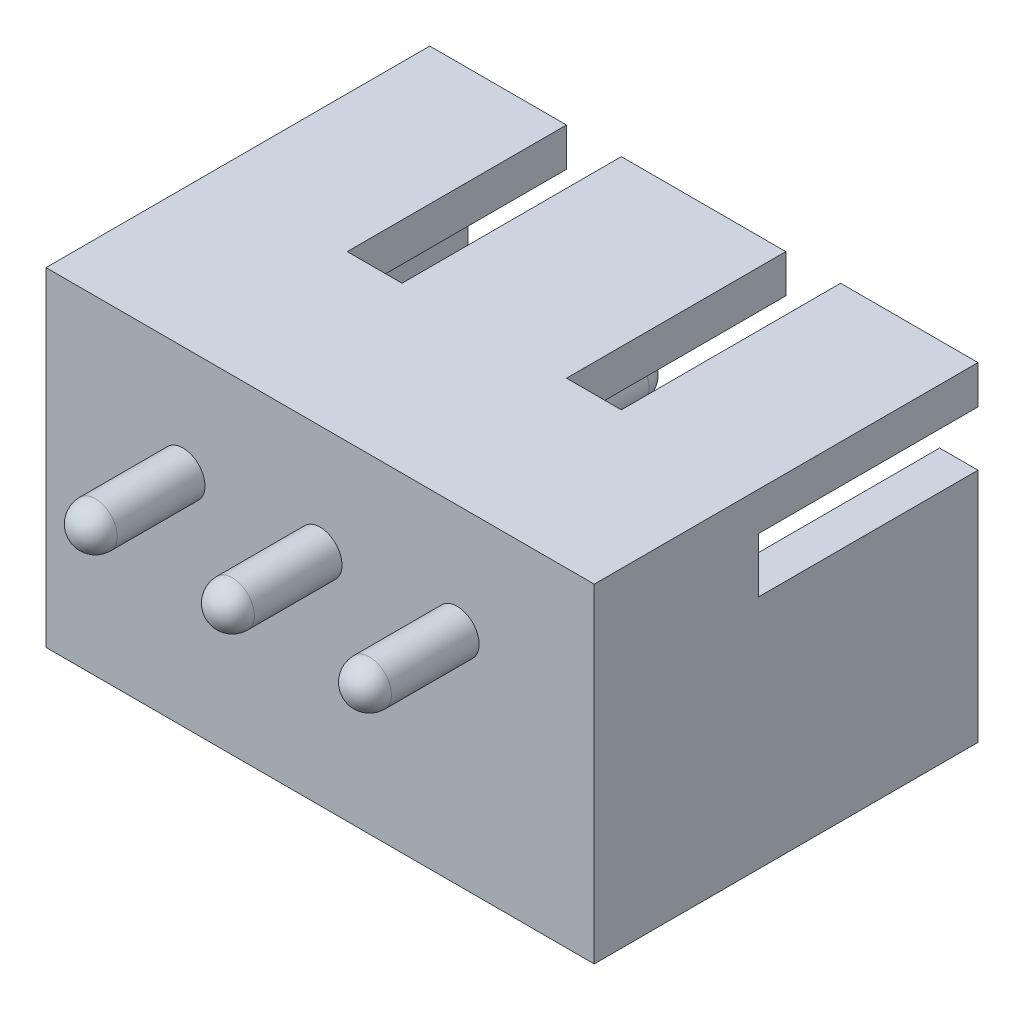
ISO-10303-21;
HEADER;
FILE_DESCRIPTION(('STEP AP214'),'2;1');
FILE_NAME('part.step','',(''),(''),'','','');
FILE_SCHEMA(('AUTOMOTIVE_DESIGN { 1 0 10303 214 1 1 1 1 }'));
ENDSEC;
DATA;
#1=APPLICATION_CONTEXT('core data for automotive mechanical design processes');
#2=APPLICATION_PROTOCOL_DEFINITION('international standard','automotive_design',2000,#1);
#3=PRODUCT_CONTEXT('',#1,'mechanical');
#4=PRODUCT('Part','Part','',(#3));
#5=PRODUCT_RELATED_PRODUCT_CATEGORY('part','',(#4));
#6=PRODUCT_DEFINITION_FORMATION('','',#4);
#7=PRODUCT_DEFINITION_CONTEXT('part definition',#1,'design');
#8=PRODUCT_DEFINITION('design','',#6,#7);
#9=PRODUCT_DEFINITION_SHAPE('','',#8);
#10=(LENGTH_UNIT() NAMED_UNIT(*) SI_UNIT(.MILLI.,.METRE.));
#11=(NAMED_UNIT(*) PLANE_ANGLE_UNIT() SI_UNIT($,.RADIAN.));
#12=(NAMED_UNIT(*) SI_UNIT($,.STERADIAN.) SOLID_ANGLE_UNIT());
#13=UNCERTAINTY_MEASURE_WITH_UNIT(LENGTH_MEASURE(1.E-05),#10,'distance_accuracy_value','');
#14=(GEOMETRIC_REPRESENTATION_CONTEXT(3) GLOBAL_UNCERTAINTY_ASSIGNED_CONTEXT((#13)) GLOBAL_UNIT_ASSIGNED_CONTEXT((#10,
#11,#12)) REPRESENTATION_CONTEXT('',''));
#15=CARTESIAN_POINT('',(0.,0.,0.));
#16=DIRECTION('',(0.,0.,1.));
#17=DIRECTION('',(1.,0.,0.));
#18=AXIS2_PLACEMENT_3D('',#15,#16,#17);
#19=CARTESIAN_POINT('',(0.,6.,0.));
#20=DIRECTION('',(0.,0.,-1.));
#21=DIRECTION('',(-1.,0.,0.));
#22=AXIS2_PLACEMENT_3D('',#19,#20,#21);
#23=PLANE('',#22);
#24=DIRECTION('',(1.,0.,0.));
#25=VECTOR('',#24,1.);
#26=CARTESIAN_POINT('',(0.,4.3,0.));
#27=LINE('',#26,#25);
#28=CARTESIAN_POINT('',(9.3,4.3,0.));
#29=VERTEX_POINT('',#28);
#30=CARTESIAN_POINT('',(10.,4.3,0.));
#31=VERTEX_POINT('',#30);
#32=EDGE_CURVE('E427',#29,#31,#27,.T.);
#33=ORIENTED_EDGE('',*,*,#32,.T.);
#34=DIRECTION('',(0.,1.,0.));
#35=VECTOR('',#34,1.);
#36=CARTESIAN_POINT('',(10.,0.,0.));
#37=LINE('',#36,#35);
#38=CARTESIAN_POINT('',(10.,0.,0.));
#39=VERTEX_POINT('',#38);
#40=EDGE_CURVE('E225',#39,#31,#37,.T.);
#41=ORIENTED_EDGE('',*,*,#40,.F.);
#42=DIRECTION('',(1.,0.,0.));
#43=VECTOR('',#42,1.);
#44=CARTESIAN_POINT('',(0.,0.,0.));
#45=LINE('',#44,#43);
#46=CARTESIAN_POINT('',(0.,0.,0.));
#47=VERTEX_POINT('',#46);
#48=EDGE_CURVE('E215',#47,#39,#45,.T.);
#49=ORIENTED_EDGE('',*,*,#48,.F.);
#50=DIRECTION('',(0.,-1.,0.));
#51=VECTOR('',#50,1.);
#52=CARTESIAN_POINT('',(0.,0.,0.));
#53=LINE('',#52,#51);
#54=CARTESIAN_POINT('',(0.,4.3,0.));
#55=VERTEX_POINT('',#54);
#56=EDGE_CURVE('E216',#55,#47,#53,.T.);
#57=ORIENTED_EDGE('',*,*,#56,.F.);
#58=CARTESIAN_POINT('',(0.7,4.3,0.));
#59=VERTEX_POINT('',#58);
#60=EDGE_CURVE('E421',#55,#59,#27,.T.);
#61=ORIENTED_EDGE('',*,*,#60,.T.);
#62=DIRECTION('',(0.,-1.,0.));
#63=VECTOR('',#62,1.);
#64=CARTESIAN_POINT('',(0.699999999999999,0.699999999999999,0.));
#65=LINE('',#64,#63);
#66=CARTESIAN_POINT('',(0.699999999999999,0.699999999999999,0.));
#67=VERTEX_POINT('',#66);
#68=EDGE_CURVE('E360',#59,#67,#65,.T.);
#69=ORIENTED_EDGE('',*,*,#68,.T.);
#70=DIRECTION('',(1.,0.,0.));
#71=VECTOR('',#70,1.);
#72=CARTESIAN_POINT('',(9.3,0.7,0.));
#73=LINE('',#72,#71);
#74=CARTESIAN_POINT('',(9.3,0.7,0.));
#75=VERTEX_POINT('',#74);
#76=EDGE_CURVE('E372',#67,#75,#73,.T.);
#77=ORIENTED_EDGE('',*,*,#76,.T.);
#78=DIRECTION('',(0.,1.,0.));
#79=VECTOR('',#78,1.);
#80=CARTESIAN_POINT('',(9.3,5.3,0.));
#81=LINE('',#80,#79);
#82=EDGE_CURVE('E195',#75,#29,#81,.T.);
#83=ORIENTED_EDGE('',*,*,#82,.T.);
#84=EDGE_LOOP('',(#33,#41,#49,#57,#61,#69,#77,#83));
#85=FACE_BOUND('',#84,.T.);
#86=ADVANCED_FACE('F35',(#85),#23,.T.);
#87=DIRECTION('',(-1.,0.,0.));
#88=VECTOR('',#87,1.);
#89=CARTESIAN_POINT('',(0.7,5.3,0.));
#90=LINE('',#89,#88);
#91=CARTESIAN_POINT('',(2.49408032981119,5.3,0.));
#92=VERTEX_POINT('',#91);
#93=CARTESIAN_POINT('',(0.,5.3,0.));
#94=VERTEX_POINT('',#93);
#95=EDGE_CURVE('E186',#92,#94,#90,.T.);
#96=ORIENTED_EDGE('',*,*,#95,.T.);
#97=CARTESIAN_POINT('',(0.,6.,0.));
#98=VERTEX_POINT('',#97);
#99=EDGE_CURVE('E191',#98,#94,#53,.T.);
#100=ORIENTED_EDGE('',*,*,#99,.F.);
#101=DIRECTION('',(-1.,0.,0.));
#102=VECTOR('',#101,1.);
#103=CARTESIAN_POINT('',(0.,6.,0.));
#104=LINE('',#103,#102);
#105=CARTESIAN_POINT('',(2.49408032981119,6.,0.));
#106=VERTEX_POINT('',#105);
#107=EDGE_CURVE('E228',#106,#98,#104,.T.);
#108=ORIENTED_EDGE('',*,*,#107,.F.);
#109=DIRECTION('',(0.,1.,0.));
#110=VECTOR('',#109,1.);
#111=CARTESIAN_POINT('',(2.49408032981119,-0.00100000000000013,0.));
#112=LINE('',#111,#110);
#113=EDGE_CURVE('E192',#92,#106,#112,.T.);
#114=ORIENTED_EDGE('',*,*,#113,.F.);
#115=EDGE_LOOP('',(#96,#100,#108,#114));
#116=FACE_BOUND('',#115,.T.);
#117=ADVANCED_FACE('F188',(#116),#23,.T.);
#118=CARTESIAN_POINT('',(10.,5.3,0.));
#119=VERTEX_POINT('',#118);
#120=CARTESIAN_POINT('',(10.,6.,0.));
#121=VERTEX_POINT('',#120);
#122=EDGE_CURVE('E218',#119,#121,#37,.T.);
#123=ORIENTED_EDGE('',*,*,#122,.F.);
#124=CARTESIAN_POINT('',(7.49408032981119,5.3,0.));
#125=VERTEX_POINT('',#124);
#126=EDGE_CURVE('E197',#119,#125,#90,.T.);
#127=ORIENTED_EDGE('',*,*,#126,.T.);
#128=DIRECTION('',(0.,1.,0.));
#129=VECTOR('',#128,1.);
#130=CARTESIAN_POINT('',(7.49408032981119,-0.00100000000000013,0.));
#131=LINE('',#130,#129);
#132=CARTESIAN_POINT('',(7.49408032981119,6.,0.));
#133=VERTEX_POINT('',#132);
#134=EDGE_CURVE('E349',#125,#133,#131,.T.);
#135=ORIENTED_EDGE('',*,*,#134,.T.);
#136=EDGE_CURVE('E229',#121,#133,#104,.T.);
#137=ORIENTED_EDGE('',*,*,#136,.F.);
#138=EDGE_LOOP('',(#123,#127,#135,#137));
#139=FACE_BOUND('',#138,.T.);
#140=ADVANCED_FACE('F290',(#139),#23,.T.);
#141=DIRECTION('',(0.,1.,0.));
#142=VECTOR('',#141,1.);
#143=CARTESIAN_POINT('',(3.49408032981119,-0.00100000000000013,0.));
#144=LINE('',#143,#142);
#145=CARTESIAN_POINT('',(3.49408032981119,5.3,0.));
#146=VERTEX_POINT('',#145);
#147=CARTESIAN_POINT('',(3.49408032981119,6.,0.));
#148=VERTEX_POINT('',#147);
#149=EDGE_CURVE('E58',#146,#148,#144,.T.);
#150=ORIENTED_EDGE('',*,*,#149,.T.);
#151=CARTESIAN_POINT('',(6.49408032981119,6.,0.));
#152=VERTEX_POINT('',#151);
#153=EDGE_CURVE('E233',#152,#148,#104,.T.);
#154=ORIENTED_EDGE('',*,*,#153,.F.);
#155=DIRECTION('',(0.,1.,0.));
#156=VECTOR('',#155,1.);
#157=CARTESIAN_POINT('',(6.49408032981119,-0.00100000000000013,0.));
#158=LINE('',#157,#156);
#159=CARTESIAN_POINT('',(6.49408032981119,5.3,0.));
#160=VERTEX_POINT('',#159);
#161=EDGE_CURVE('E348',#160,#152,#158,.T.);
#162=ORIENTED_EDGE('',*,*,#161,.F.);
#163=EDGE_CURVE('E194',#160,#146,#90,.T.);
#164=ORIENTED_EDGE('',*,*,#163,.T.);
#165=EDGE_LOOP('',(#150,#154,#162,#164));
#166=FACE_BOUND('',#165,.T.);
#167=ADVANCED_FACE('F286',(#166),#23,.T.);
#168=CARTESIAN_POINT('',(0.,0.,7.));
#169=DIRECTION('',(1.,0.,0.));
#170=DIRECTION('',(0.,0.,-1.));
#171=AXIS2_PLACEMENT_3D('',#168,#169,#170);
#172=PLANE('',#171);
#173=DIRECTION('',(0.,-1.,0.));
#174=VECTOR('',#173,1.);
#175=CARTESIAN_POINT('',(0.,5.3,4.));
#176=LINE('',#175,#174);
#177=CARTESIAN_POINT('',(0.,5.3,4.));
#178=VERTEX_POINT('',#177);
#179=CARTESIAN_POINT('',(0.,4.3,4.));
#180=VERTEX_POINT('',#179);
#181=EDGE_CURVE('E207',#178,#180,#176,.T.);
#182=ORIENTED_EDGE('',*,*,#181,.T.);
#183=DIRECTION('',(0.,0.,-1.));
#184=VECTOR('',#183,1.);
#185=CARTESIAN_POINT('',(0.,4.3,0.));
#186=LINE('',#185,#184);
#187=EDGE_CURVE('E437',#180,#55,#186,.T.);
#188=ORIENTED_EDGE('',*,*,#187,.T.);
#189=ORIENTED_EDGE('',*,*,#56,.T.);
#190=DIRECTION('',(0.,0.,-1.));
#191=VECTOR('',#190,1.);
#192=CARTESIAN_POINT('',(0.,0.,7.));
#193=LINE('',#192,#191);
#194=CARTESIAN_POINT('',(0.,0.,7.));
#195=VERTEX_POINT('',#194);
#196=EDGE_CURVE('E241',#195,#47,#193,.T.);
#197=ORIENTED_EDGE('',*,*,#196,.F.);
#198=DIRECTION('',(0.,-1.,0.));
#199=VECTOR('',#198,1.);
#200=CARTESIAN_POINT('',(0.,0.,7.));
#201=LINE('',#200,#199);
#202=CARTESIAN_POINT('',(0.,6.,7.));
#203=VERTEX_POINT('',#202);
#204=EDGE_CURVE('E232',#203,#195,#201,.T.);
#205=ORIENTED_EDGE('',*,*,#204,.F.);
#206=DIRECTION('',(0.,0.,-1.));
#207=VECTOR('',#206,1.);
#208=CARTESIAN_POINT('',(0.,6.,7.));
#209=LINE('',#208,#207);
#210=EDGE_CURVE('E214',#203,#98,#209,.T.);
#211=ORIENTED_EDGE('',*,*,#210,.T.);
#212=ORIENTED_EDGE('',*,*,#99,.T.);
#213=DIRECTION('',(0.,0.,1.));
#214=VECTOR('',#213,1.);
#215=CARTESIAN_POINT('',(0.,5.3,0.));
#216=LINE('',#215,#214);
#217=EDGE_CURVE('E199',#94,#178,#216,.T.);
#218=ORIENTED_EDGE('',*,*,#217,.T.);
#219=EDGE_LOOP('',(#182,#188,#189,#197,#205,#211,#212,#218));
#220=FACE_BOUND('',#219,.T.);
#221=ADVANCED_FACE('F211',(#220),#172,.F.);
#222=CARTESIAN_POINT('',(0.,0.,7.));
#223=DIRECTION('',(0.,1.,0.));
#224=DIRECTION('',(0.,0.,1.));
#225=AXIS2_PLACEMENT_3D('',#222,#223,#224);
#226=PLANE('',#225);
#227=ORIENTED_EDGE('',*,*,#48,.T.);
#228=DIRECTION('',(0.,0.,-1.));
#229=VECTOR('',#228,1.);
#230=CARTESIAN_POINT('',(10.,0.,7.));
#231=LINE('',#230,#229);
#232=CARTESIAN_POINT('',(10.,0.,7.));
#233=VERTEX_POINT('',#232);
#234=EDGE_CURVE('E238',#233,#39,#231,.T.);
#235=ORIENTED_EDGE('',*,*,#234,.F.);
#236=DIRECTION('',(1.,0.,0.));
#237=VECTOR('',#236,1.);
#238=CARTESIAN_POINT('',(0.,0.,7.));
#239=LINE('',#238,#237);
#240=EDGE_CURVE('E388',#195,#233,#239,.T.);
#241=ORIENTED_EDGE('',*,*,#240,.F.);
#242=ORIENTED_EDGE('',*,*,#196,.T.);
#243=EDGE_LOOP('',(#227,#235,#241,#242));
#244=FACE_BOUND('',#243,.T.);
#245=ADVANCED_FACE('F300',(#244),#226,.F.);
#246=CARTESIAN_POINT('',(10.,0.,7.));
#247=DIRECTION('',(-1.,0.,0.));
#248=DIRECTION('',(0.,0.,1.));
#249=AXIS2_PLACEMENT_3D('',#246,#247,#248);
#250=PLANE('',#249);
#251=ORIENTED_EDGE('',*,*,#40,.T.);
#252=DIRECTION('',(0.,0.,-1.));
#253=VECTOR('',#252,1.);
#254=CARTESIAN_POINT('',(10.,4.3,0.));
#255=LINE('',#254,#253);
#256=CARTESIAN_POINT('',(10.,4.3,4.));
#257=VERTEX_POINT('',#256);
#258=EDGE_CURVE('E208',#257,#31,#255,.T.);
#259=ORIENTED_EDGE('',*,*,#258,.F.);
#260=DIRECTION('',(0.,-1.,0.));
#261=VECTOR('',#260,1.);
#262=CARTESIAN_POINT('',(10.,5.3,4.));
#263=LINE('',#262,#261);
#264=CARTESIAN_POINT('',(10.,5.3,4.));
#265=VERTEX_POINT('',#264);
#266=EDGE_CURVE('E431',#265,#257,#263,.T.);
#267=ORIENTED_EDGE('',*,*,#266,.F.);
#268=DIRECTION('',(0.,0.,1.));
#269=VECTOR('',#268,1.);
#270=CARTESIAN_POINT('',(10.,5.3,0.));
#271=LINE('',#270,#269);
#272=EDGE_CURVE('E434',#119,#265,#271,.T.);
#273=ORIENTED_EDGE('',*,*,#272,.F.);
#274=ORIENTED_EDGE('',*,*,#122,.T.);
#275=DIRECTION('',(0.,0.,-1.));
#276=VECTOR('',#275,1.);
#277=CARTESIAN_POINT('',(10.,6.,7.));
#278=LINE('',#277,#276);
#279=CARTESIAN_POINT('',(10.,6.,7.));
#280=VERTEX_POINT('',#279);
#281=EDGE_CURVE('E235',#280,#121,#278,.T.);
#282=ORIENTED_EDGE('',*,*,#281,.F.);
#283=DIRECTION('',(0.,1.,0.));
#284=VECTOR('',#283,1.);
#285=CARTESIAN_POINT('',(10.,0.,7.));
#286=LINE('',#285,#284);
#287=EDGE_CURVE('E389',#233,#280,#286,.T.);
#288=ORIENTED_EDGE('',*,*,#287,.F.);
#289=ORIENTED_EDGE('',*,*,#234,.T.);
#290=EDGE_LOOP('',(#251,#259,#267,#273,#274,#282,#288,#289));
#291=FACE_BOUND('',#290,.T.);
#292=ADVANCED_FACE('F523',(#291),#250,.F.);
#293=CARTESIAN_POINT('',(0.,6.,7.));
#294=DIRECTION('',(0.,-1.,0.));
#295=DIRECTION('',(0.,0.,-1.));
#296=AXIS2_PLACEMENT_3D('',#293,#294,#295);
#297=PLANE('',#296);
#298=DIRECTION('',(1.,0.,0.));
#299=VECTOR('',#298,1.);
#300=CARTESIAN_POINT('',(2.49408032981119,6.,4.));
#301=LINE('',#300,#299);
#302=CARTESIAN_POINT('',(2.49408032981119,6.,4.));
#303=VERTEX_POINT('',#302);
#304=CARTESIAN_POINT('',(3.49408032981119,6.,4.));
#305=VERTEX_POINT('',#304);
#306=EDGE_CURVE('E308',#303,#305,#301,.T.);
#307=ORIENTED_EDGE('',*,*,#306,.F.);
#308=DIRECTION('',(0.,0.,1.));
#309=VECTOR('',#308,1.);
#310=CARTESIAN_POINT('',(2.49408032981119,6.,0.));
#311=LINE('',#310,#309);
#312=EDGE_CURVE('E322',#106,#303,#311,.T.);
#313=ORIENTED_EDGE('',*,*,#312,.F.);
#314=ORIENTED_EDGE('',*,*,#107,.T.);
#315=ORIENTED_EDGE('',*,*,#210,.F.);
#316=DIRECTION('',(-1.,0.,0.));
#317=VECTOR('',#316,1.);
#318=CARTESIAN_POINT('',(0.,6.,7.));
#319=LINE('',#318,#317);
#320=EDGE_CURVE('E222',#280,#203,#319,.T.);
#321=ORIENTED_EDGE('',*,*,#320,.F.);
#322=ORIENTED_EDGE('',*,*,#281,.T.);
#323=ORIENTED_EDGE('',*,*,#136,.T.);
#324=DIRECTION('',(0.,0.,-1.));
#325=VECTOR('',#324,1.);
#326=CARTESIAN_POINT('',(7.49408032981119,6.,0.));
#327=LINE('',#326,#325);
#328=CARTESIAN_POINT('',(7.49408032981119,6.,4.));
#329=VERTEX_POINT('',#328);
#330=EDGE_CURVE('E346',#329,#133,#327,.T.);
#331=ORIENTED_EDGE('',*,*,#330,.F.);
#332=DIRECTION('',(1.,0.,0.));
#333=VECTOR('',#332,1.);
#334=CARTESIAN_POINT('',(7.49408032981119,6.,4.));
#335=LINE('',#334,#333);
#336=CARTESIAN_POINT('',(6.49408032981119,6.,4.));
#337=VERTEX_POINT('',#336);
#338=EDGE_CURVE('E343',#337,#329,#335,.T.);
#339=ORIENTED_EDGE('',*,*,#338,.F.);
#340=DIRECTION('',(0.,0.,1.));
#341=VECTOR('',#340,1.);
#342=CARTESIAN_POINT('',(6.49408032981119,6.,0.));
#343=LINE('',#342,#341);
#344=EDGE_CURVE('E318',#152,#337,#343,.T.);
#345=ORIENTED_EDGE('',*,*,#344,.F.);
#346=ORIENTED_EDGE('',*,*,#153,.T.);
#347=DIRECTION('',(0.,0.,-1.));
#348=VECTOR('',#347,1.);
#349=CARTESIAN_POINT('',(3.49408032981119,6.,0.));
#350=LINE('',#349,#348);
#351=EDGE_CURVE('E315',#305,#148,#350,.T.);
#352=ORIENTED_EDGE('',*,*,#351,.F.);
#353=EDGE_LOOP('',(#307,#313,#314,#315,#321,#322,#323,#331,#339,#345,#346,#352));
#354=FACE_BOUND('',#353,.T.);
#355=ADVANCED_FACE('F314',(#354),#297,.F.);
#356=CARTESIAN_POINT('',(0.,6.,7.));
#357=DIRECTION('',(0.,0.,-1.));
#358=DIRECTION('',(-1.,0.,0.));
#359=AXIS2_PLACEMENT_3D('',#356,#357,#358);
#360=PLANE('',#359);
#361=CARTESIAN_POINT('',(2.5,4.,7.));
#362=DIRECTION('',(0.,0.,-1.));
#363=DIRECTION('',(-1.,0.,0.));
#364=AXIS2_PLACEMENT_3D('',#361,#362,#363);
#365=CIRCLE('',#364,0.4);
#366=CARTESIAN_POINT('',(2.1,4.,7.));
#367=VERTEX_POINT('',#366);
#368=EDGE_CURVE('E446',#367,#367,#365,.T.);
#369=ORIENTED_EDGE('',*,*,#368,.T.);
#370=EDGE_LOOP('',(#369));
#371=FACE_BOUND('',#370,.T.);
#372=CARTESIAN_POINT('',(7.5,4.,7.));
#373=DIRECTION('',(0.,0.,-1.));
#374=DIRECTION('',(-1.,0.,0.));
#375=AXIS2_PLACEMENT_3D('',#372,#373,#374);
#376=CIRCLE('',#375,0.4);
#377=CARTESIAN_POINT('',(7.1,4.,7.));
#378=VERTEX_POINT('',#377);
#379=EDGE_CURVE('E443',#378,#378,#376,.T.);
#380=ORIENTED_EDGE('',*,*,#379,.T.);
#381=EDGE_LOOP('',(#380));
#382=FACE_BOUND('',#381,.T.);
#383=CARTESIAN_POINT('',(5.,4.,7.));
#384=DIRECTION('',(0.,0.,-1.));
#385=DIRECTION('',(-1.,0.,0.));
#386=AXIS2_PLACEMENT_3D('',#383,#384,#385);
#387=CIRCLE('',#386,0.4);
#388=CARTESIAN_POINT('',(4.6,4.,7.));
#389=VERTEX_POINT('',#388);
#390=EDGE_CURVE('E436',#389,#389,#387,.T.);
#391=ORIENTED_EDGE('',*,*,#390,.T.);
#392=EDGE_LOOP('',(#391));
#393=FACE_BOUND('',#392,.T.);
#394=ORIENTED_EDGE('',*,*,#204,.T.);
#395=ORIENTED_EDGE('',*,*,#240,.T.);
#396=ORIENTED_EDGE('',*,*,#287,.T.);
#397=ORIENTED_EDGE('',*,*,#320,.T.);
#398=EDGE_LOOP('',(#394,#395,#396,#397));
#399=FACE_BOUND('',#398,.T.);
#400=ADVANCED_FACE('F393',(#371,#382,#393,#399),#360,.F.);
#401=CARTESIAN_POINT('',(0.699999999999999,0.699999999999999,5.));
#402=DIRECTION('',(1.,0.,0.));
#403=DIRECTION('',(0.,1.,0.));
#404=AXIS2_PLACEMENT_3D('',#401,#402,#403);
#405=PLANE('',#404);
#406=DIRECTION('',(0.,0.,-1.));
#407=VECTOR('',#406,1.);
#408=CARTESIAN_POINT('',(0.7,4.3,5.));
#409=LINE('',#408,#407);
#410=CARTESIAN_POINT('',(0.7,4.3,4.));
#411=VERTEX_POINT('',#410);
#412=EDGE_CURVE('E415',#411,#59,#409,.T.);
#413=ORIENTED_EDGE('',*,*,#412,.F.);
#414=DIRECTION('',(0.,-1.,0.));
#415=VECTOR('',#414,1.);
#416=CARTESIAN_POINT('',(0.699999999999999,0.699999999999998,4.));
#417=LINE('',#416,#415);
#418=CARTESIAN_POINT('',(0.7,5.3,4.));
#419=VERTEX_POINT('',#418);
#420=EDGE_CURVE('E417',#419,#411,#417,.T.);
#421=ORIENTED_EDGE('',*,*,#420,.F.);
#422=DIRECTION('',(0.,0.,-1.));
#423=VECTOR('',#422,1.);
#424=CARTESIAN_POINT('',(0.7,5.3,5.));
#425=LINE('',#424,#423);
#426=CARTESIAN_POINT('',(0.7,5.3,5.));
#427=VERTEX_POINT('',#426);
#428=EDGE_CURVE('E370',#427,#419,#425,.T.);
#429=ORIENTED_EDGE('',*,*,#428,.F.);
#430=DIRECTION('',(0.,-1.,0.));
#431=VECTOR('',#430,1.);
#432=CARTESIAN_POINT('',(0.699999999999999,0.699999999999999,5.));
#433=LINE('',#432,#431);
#434=CARTESIAN_POINT('',(0.699999999999999,0.699999999999999,5.));
#435=VERTEX_POINT('',#434);
#436=EDGE_CURVE('E361',#427,#435,#433,.T.);
#437=ORIENTED_EDGE('',*,*,#436,.T.);
#438=DIRECTION('',(0.,0.,-1.));
#439=VECTOR('',#438,1.);
#440=CARTESIAN_POINT('',(0.699999999999999,0.699999999999999,5.));
#441=LINE('',#440,#439);
#442=EDGE_CURVE('E220',#435,#67,#441,.T.);
#443=ORIENTED_EDGE('',*,*,#442,.T.);
#444=ORIENTED_EDGE('',*,*,#68,.F.);
#445=EDGE_LOOP('',(#413,#421,#429,#437,#443,#444));
#446=FACE_BOUND('',#445,.T.);
#447=ADVANCED_FACE('F515',(#446),#405,.T.);
#448=CARTESIAN_POINT('',(9.3,0.7,5.));
#449=DIRECTION('',(0.,1.,0.));
#450=DIRECTION('',(-1.,0.,0.));
#451=AXIS2_PLACEMENT_3D('',#448,#449,#450);
#452=PLANE('',#451);
#453=ORIENTED_EDGE('',*,*,#76,.F.);
#454=ORIENTED_EDGE('',*,*,#442,.F.);
#455=DIRECTION('',(1.,0.,0.));
#456=VECTOR('',#455,1.);
#457=CARTESIAN_POINT('',(9.3,0.7,5.));
#458=LINE('',#457,#456);
#459=CARTESIAN_POINT('',(9.3,0.7,5.));
#460=VERTEX_POINT('',#459);
#461=EDGE_CURVE('E364',#435,#460,#458,.T.);
#462=ORIENTED_EDGE('',*,*,#461,.T.);
#463=DIRECTION('',(0.,0.,-1.));
#464=VECTOR('',#463,1.);
#465=CARTESIAN_POINT('',(9.3,0.7,5.));
#466=LINE('',#465,#464);
#467=EDGE_CURVE('E382',#460,#75,#466,.T.);
#468=ORIENTED_EDGE('',*,*,#467,.T.);
#469=EDGE_LOOP('',(#453,#454,#462,#468));
#470=FACE_BOUND('',#469,.T.);
#471=ADVANCED_FACE('F511',(#470),#452,.T.);
#472=CARTESIAN_POINT('',(9.3,5.3,5.));
#473=DIRECTION('',(-1.,0.,0.));
#474=DIRECTION('',(0.,0.,1.));
#475=AXIS2_PLACEMENT_3D('',#472,#473,#474);
#476=PLANE('',#475);
#477=DIRECTION('',(0.,0.,1.));
#478=VECTOR('',#477,1.);
#479=CARTESIAN_POINT('',(9.3,4.3,5.));
#480=LINE('',#479,#478);
#481=CARTESIAN_POINT('',(9.3,4.3,4.));
#482=VERTEX_POINT('',#481);
#483=EDGE_CURVE('E244',#29,#482,#480,.T.);
#484=ORIENTED_EDGE('',*,*,#483,.F.);
#485=ORIENTED_EDGE('',*,*,#82,.F.);
#486=ORIENTED_EDGE('',*,*,#467,.F.);
#487=DIRECTION('',(0.,1.,0.));
#488=VECTOR('',#487,1.);
#489=CARTESIAN_POINT('',(9.3,5.3,5.));
#490=LINE('',#489,#488);
#491=CARTESIAN_POINT('',(9.3,5.3,5.));
#492=VERTEX_POINT('',#491);
#493=EDGE_CURVE('E366',#460,#492,#490,.T.);
#494=ORIENTED_EDGE('',*,*,#493,.T.);
#495=DIRECTION('',(0.,0.,-1.));
#496=VECTOR('',#495,1.);
#497=CARTESIAN_POINT('',(9.3,5.3,5.));
#498=LINE('',#497,#496);
#499=CARTESIAN_POINT('',(9.3,5.3,4.));
#500=VERTEX_POINT('',#499);
#501=EDGE_CURVE('E379',#492,#500,#498,.T.);
#502=ORIENTED_EDGE('',*,*,#501,.T.);
#503=DIRECTION('',(0.,1.,0.));
#504=VECTOR('',#503,1.);
#505=CARTESIAN_POINT('',(9.3,5.3,4.));
#506=LINE('',#505,#504);
#507=EDGE_CURVE('E419',#482,#500,#506,.T.);
#508=ORIENTED_EDGE('',*,*,#507,.F.);
#509=EDGE_LOOP('',(#484,#485,#486,#494,#502,#508));
#510=FACE_BOUND('',#509,.T.);
#511=ADVANCED_FACE('F508',(#510),#476,.T.);
#512=CARTESIAN_POINT('',(0.7,5.3,5.));
#513=DIRECTION('',(0.,-1.,0.));
#514=DIRECTION('',(0.,0.,-1.));
#515=AXIS2_PLACEMENT_3D('',#512,#513,#514);
#516=PLANE('',#515);
#517=DIRECTION('',(1.,0.,0.));
#518=VECTOR('',#517,1.);
#519=CARTESIAN_POINT('',(7.49408032981119,5.3,4.));
#520=LINE('',#519,#518);
#521=CARTESIAN_POINT('',(6.49408032981119,5.3,4.));
#522=VERTEX_POINT('',#521);
#523=CARTESIAN_POINT('',(7.49408032981119,5.3,4.));
#524=VERTEX_POINT('',#523);
#525=EDGE_CURVE('E334',#522,#524,#520,.T.);
#526=ORIENTED_EDGE('',*,*,#525,.T.);
#527=DIRECTION('',(0.,0.,-1.));
#528=VECTOR('',#527,1.);
#529=CARTESIAN_POINT('',(7.49408032981119,5.3,0.));
#530=LINE('',#529,#528);
#531=EDGE_CURVE('E339',#524,#125,#530,.T.);
#532=ORIENTED_EDGE('',*,*,#531,.T.);
#533=ORIENTED_EDGE('',*,*,#126,.F.);
#534=ORIENTED_EDGE('',*,*,#272,.T.);
#535=DIRECTION('',(1.,0.,0.));
#536=VECTOR('',#535,1.);
#537=CARTESIAN_POINT('',(0.,5.3,4.));
#538=LINE('',#537,#536);
#539=EDGE_CURVE('E50',#500,#265,#538,.T.);
#540=ORIENTED_EDGE('',*,*,#539,.F.);
#541=ORIENTED_EDGE('',*,*,#501,.F.);
#542=DIRECTION('',(-1.,0.,0.));
#543=VECTOR('',#542,1.);
#544=CARTESIAN_POINT('',(0.7,5.3,5.));
#545=LINE('',#544,#543);
#546=EDGE_CURVE('E368',#492,#427,#545,.T.);
#547=ORIENTED_EDGE('',*,*,#546,.T.);
#548=ORIENTED_EDGE('',*,*,#428,.T.);
#549=EDGE_CURVE('E203',#178,#419,#538,.T.);
#550=ORIENTED_EDGE('',*,*,#549,.F.);
#551=ORIENTED_EDGE('',*,*,#217,.F.);
#552=ORIENTED_EDGE('',*,*,#95,.F.);
#553=DIRECTION('',(0.,0.,1.));
#554=VECTOR('',#553,1.);
#555=CARTESIAN_POINT('',(2.49408032981119,5.3,0.));
#556=LINE('',#555,#554);
#557=CARTESIAN_POINT('',(2.49408032981119,5.3,4.));
#558=VERTEX_POINT('',#557);
#559=EDGE_CURVE('E411',#92,#558,#556,.T.);
#560=ORIENTED_EDGE('',*,*,#559,.T.);
#561=DIRECTION('',(1.,0.,0.));
#562=VECTOR('',#561,1.);
#563=CARTESIAN_POINT('',(2.49408032981119,5.3,4.));
#564=LINE('',#563,#562);
#565=CARTESIAN_POINT('',(3.49408032981119,5.3,4.));
#566=VERTEX_POINT('',#565);
#567=EDGE_CURVE('E409',#558,#566,#564,.T.);
#568=ORIENTED_EDGE('',*,*,#567,.T.);
#569=DIRECTION('',(0.,0.,-1.));
#570=VECTOR('',#569,1.);
#571=CARTESIAN_POINT('',(3.49408032981119,5.3,0.));
#572=LINE('',#571,#570);
#573=EDGE_CURVE('E328',#566,#146,#572,.T.);
#574=ORIENTED_EDGE('',*,*,#573,.T.);
#575=ORIENTED_EDGE('',*,*,#163,.F.);
#576=DIRECTION('',(0.,0.,1.));
#577=VECTOR('',#576,1.);
#578=CARTESIAN_POINT('',(6.49408032981119,5.3,0.));
#579=LINE('',#578,#577);
#580=EDGE_CURVE('E352',#160,#522,#579,.T.);
#581=ORIENTED_EDGE('',*,*,#580,.T.);
#582=EDGE_LOOP('',(#526,#532,#533,#534,#540,#541,#547,#548,#550,#551,#552,#560,#568,#574,#575,#581));
#583=FACE_BOUND('',#582,.T.);
#584=ADVANCED_FACE('F201',(#583),#516,.T.);
#585=CARTESIAN_POINT('',(0.7,5.3,5.));
#586=DIRECTION('',(0.,0.,-1.));
#587=DIRECTION('',(-1.,0.,0.));
#588=AXIS2_PLACEMENT_3D('',#585,#586,#587);
#589=PLANE('',#588);
#590=CARTESIAN_POINT('',(2.5,4.,5.));
#591=DIRECTION('',(0.,0.,-1.));
#592=DIRECTION('',(-1.,0.,0.));
#593=AXIS2_PLACEMENT_3D('',#590,#591,#592);
#594=CIRCLE('',#593,0.4);
#595=CARTESIAN_POINT('',(2.1,4.,5.));
#596=VERTEX_POINT('',#595);
#597=EDGE_CURVE('E252',#596,#596,#594,.T.);
#598=ORIENTED_EDGE('',*,*,#597,.F.);
#599=EDGE_LOOP('',(#598));
#600=FACE_BOUND('',#599,.T.);
#601=CARTESIAN_POINT('',(7.5,4.,5.));
#602=DIRECTION('',(0.,0.,-1.));
#603=DIRECTION('',(-1.,0.,0.));
#604=AXIS2_PLACEMENT_3D('',#601,#602,#603);
#605=CIRCLE('',#604,0.4);
#606=CARTESIAN_POINT('',(7.1,4.,5.));
#607=VERTEX_POINT('',#606);
#608=EDGE_CURVE('E249',#607,#607,#605,.T.);
#609=ORIENTED_EDGE('',*,*,#608,.F.);
#610=EDGE_LOOP('',(#609));
#611=FACE_BOUND('',#610,.T.);
#612=CARTESIAN_POINT('',(5.,4.,5.));
#613=DIRECTION('',(0.,0.,-1.));
#614=DIRECTION('',(-1.,0.,0.));
#615=AXIS2_PLACEMENT_3D('',#612,#613,#614);
#616=CIRCLE('',#615,0.4);
#617=CARTESIAN_POINT('',(4.6,4.,5.));
#618=VERTEX_POINT('',#617);
#619=EDGE_CURVE('E246',#618,#618,#616,.T.);
#620=ORIENTED_EDGE('',*,*,#619,.F.);
#621=EDGE_LOOP('',(#620));
#622=FACE_BOUND('',#621,.T.);
#623=ORIENTED_EDGE('',*,*,#436,.F.);
#624=ORIENTED_EDGE('',*,*,#546,.F.);
#625=ORIENTED_EDGE('',*,*,#493,.F.);
#626=ORIENTED_EDGE('',*,*,#461,.F.);
#627=EDGE_LOOP('',(#623,#624,#625,#626));
#628=FACE_BOUND('',#627,.T.);
#629=ADVANCED_FACE('F502',(#600,#611,#622,#628),#589,.T.);
#630=CARTESIAN_POINT('',(6.49408032981119,-0.00100000000000013,0.));
#631=DIRECTION('',(-1.,0.,0.));
#632=DIRECTION('',(0.,0.,1.));
#633=AXIS2_PLACEMENT_3D('',#630,#631,#632);
#634=PLANE('',#633);
#635=ORIENTED_EDGE('',*,*,#161,.T.);
#636=ORIENTED_EDGE('',*,*,#344,.T.);
#637=DIRECTION('',(0.,1.,0.));
#638=VECTOR('',#637,1.);
#639=CARTESIAN_POINT('',(6.49408032981119,-0.00100000000000013,4.));
#640=LINE('',#639,#638);
#641=EDGE_CURVE('E355',#522,#337,#640,.T.);
#642=ORIENTED_EDGE('',*,*,#641,.F.);
#643=ORIENTED_EDGE('',*,*,#580,.F.);
#644=EDGE_LOOP('',(#635,#636,#642,#643));
#645=FACE_BOUND('',#644,.T.);
#646=ADVANCED_FACE('F407',(#645),#634,.F.);
#647=CARTESIAN_POINT('',(7.49408032981119,-0.00100000000000013,4.));
#648=DIRECTION('',(0.,0.,1.));
#649=DIRECTION('',(1.,0.,0.));
#650=AXIS2_PLACEMENT_3D('',#647,#648,#649);
#651=PLANE('',#650);
#652=ORIENTED_EDGE('',*,*,#641,.T.);
#653=ORIENTED_EDGE('',*,*,#338,.T.);
#654=DIRECTION('',(0.,1.,0.));
#655=VECTOR('',#654,1.);
#656=CARTESIAN_POINT('',(7.49408032981119,-0.00100000000000013,4.));
#657=LINE('',#656,#655);
#658=EDGE_CURVE('E353',#524,#329,#657,.T.);
#659=ORIENTED_EDGE('',*,*,#658,.F.);
#660=ORIENTED_EDGE('',*,*,#525,.F.);
#661=EDGE_LOOP('',(#652,#653,#659,#660));
#662=FACE_BOUND('',#661,.T.);
#663=ADVANCED_FACE('F405',(#662),#651,.F.);
#664=CARTESIAN_POINT('',(7.49408032981119,-0.00100000000000013,0.));
#665=DIRECTION('',(1.,0.,0.));
#666=DIRECTION('',(0.,0.,-1.));
#667=AXIS2_PLACEMENT_3D('',#664,#665,#666);
#668=PLANE('',#667);
#669=ORIENTED_EDGE('',*,*,#658,.T.);
#670=ORIENTED_EDGE('',*,*,#330,.T.);
#671=ORIENTED_EDGE('',*,*,#134,.F.);
#672=ORIENTED_EDGE('',*,*,#531,.F.);
#673=EDGE_LOOP('',(#669,#670,#671,#672));
#674=FACE_BOUND('',#673,.T.);
#675=ADVANCED_FACE('F400',(#674),#668,.F.);
#676=CARTESIAN_POINT('',(2.49408032981119,-0.00100000000000013,0.));
#677=DIRECTION('',(-1.,0.,0.));
#678=DIRECTION('',(0.,0.,1.));
#679=AXIS2_PLACEMENT_3D('',#676,#677,#678);
#680=PLANE('',#679);
#681=ORIENTED_EDGE('',*,*,#113,.T.);
#682=ORIENTED_EDGE('',*,*,#312,.T.);
#683=DIRECTION('',(0.,1.,0.));
#684=VECTOR('',#683,1.);
#685=CARTESIAN_POINT('',(2.49408032981119,-0.00100000000000013,4.));
#686=LINE('',#685,#684);
#687=EDGE_CURVE('E335',#558,#303,#686,.T.);
#688=ORIENTED_EDGE('',*,*,#687,.F.);
#689=ORIENTED_EDGE('',*,*,#559,.F.);
#690=EDGE_LOOP('',(#681,#682,#688,#689));
#691=FACE_BOUND('',#690,.T.);
#692=ADVANCED_FACE('F490',(#691),#680,.F.);
#693=CARTESIAN_POINT('',(2.49408032981119,-0.00100000000000013,4.));
#694=DIRECTION('',(0.,0.,1.));
#695=DIRECTION('',(1.,0.,0.));
#696=AXIS2_PLACEMENT_3D('',#693,#694,#695);
#697=PLANE('',#696);
#698=ORIENTED_EDGE('',*,*,#687,.T.);
#699=ORIENTED_EDGE('',*,*,#306,.T.);
#700=DIRECTION('',(0.,1.,0.));
#701=VECTOR('',#700,1.);
#702=CARTESIAN_POINT('',(3.49408032981119,-0.00100000000000013,4.));
#703=LINE('',#702,#701);
#704=EDGE_CURVE('E332',#566,#305,#703,.T.);
#705=ORIENTED_EDGE('',*,*,#704,.F.);
#706=ORIENTED_EDGE('',*,*,#567,.F.);
#707=EDGE_LOOP('',(#698,#699,#705,#706));
#708=FACE_BOUND('',#707,.T.);
#709=ADVANCED_FACE('F487',(#708),#697,.F.);
#710=CARTESIAN_POINT('',(3.49408032981119,-0.00100000000000013,0.));
#711=DIRECTION('',(1.,0.,0.));
#712=DIRECTION('',(0.,0.,-1.));
#713=AXIS2_PLACEMENT_3D('',#710,#711,#712);
#714=PLANE('',#713);
#715=ORIENTED_EDGE('',*,*,#704,.T.);
#716=ORIENTED_EDGE('',*,*,#351,.T.);
#717=ORIENTED_EDGE('',*,*,#149,.F.);
#718=ORIENTED_EDGE('',*,*,#573,.F.);
#719=EDGE_LOOP('',(#715,#716,#717,#718));
#720=FACE_BOUND('',#719,.T.);
#721=ADVANCED_FACE('F485',(#720),#714,.F.);
#722=CARTESIAN_POINT('',(0.,5.3,4.));
#723=DIRECTION('',(0.,0.,1.));
#724=DIRECTION('',(0.,-1.,0.));
#725=AXIS2_PLACEMENT_3D('',#722,#723,#724);
#726=PLANE('',#725);
#727=ORIENTED_EDGE('',*,*,#507,.T.);
#728=ORIENTED_EDGE('',*,*,#539,.T.);
#729=ORIENTED_EDGE('',*,*,#266,.T.);
#730=DIRECTION('',(1.,0.,0.));
#731=VECTOR('',#730,1.);
#732=CARTESIAN_POINT('',(0.,4.3,4.));
#733=LINE('',#732,#731);
#734=EDGE_CURVE('E423',#482,#257,#733,.T.);
#735=ORIENTED_EDGE('',*,*,#734,.F.);
#736=EDGE_LOOP('',(#727,#728,#729,#735));
#737=FACE_BOUND('',#736,.T.);
#738=ADVANCED_FACE('F481',(#737),#726,.F.);
#739=CARTESIAN_POINT('',(0.,4.3,0.));
#740=DIRECTION('',(0.,-1.,0.));
#741=DIRECTION('',(0.,0.,-1.));
#742=AXIS2_PLACEMENT_3D('',#739,#740,#741);
#743=PLANE('',#742);
#744=ORIENTED_EDGE('',*,*,#483,.T.);
#745=ORIENTED_EDGE('',*,*,#734,.T.);
#746=ORIENTED_EDGE('',*,*,#258,.T.);
#747=ORIENTED_EDGE('',*,*,#32,.F.);
#748=EDGE_LOOP('',(#744,#745,#746,#747));
#749=FACE_BOUND('',#748,.T.);
#750=ADVANCED_FACE('F477',(#749),#743,.F.);
#751=ORIENTED_EDGE('',*,*,#412,.T.);
#752=ORIENTED_EDGE('',*,*,#60,.F.);
#753=ORIENTED_EDGE('',*,*,#187,.F.);
#754=EDGE_CURVE('E424',#180,#411,#733,.T.);
#755=ORIENTED_EDGE('',*,*,#754,.T.);
#756=EDGE_LOOP('',(#751,#752,#753,#755));
#757=FACE_BOUND('',#756,.T.);
#758=ADVANCED_FACE('F480',(#757),#743,.F.);
#759=ORIENTED_EDGE('',*,*,#420,.T.);
#760=ORIENTED_EDGE('',*,*,#754,.F.);
#761=ORIENTED_EDGE('',*,*,#181,.F.);
#762=ORIENTED_EDGE('',*,*,#549,.T.);
#763=EDGE_LOOP('',(#759,#760,#761,#762));
#764=FACE_BOUND('',#763,.T.);
#765=ADVANCED_FACE('F475',(#764),#726,.F.);
#766=CARTESIAN_POINT('',(5.,4.,9.));
#767=DIRECTION('',(0.,0.,-1.));
#768=DIRECTION('',(-1.,0.,0.));
#769=AXIS2_PLACEMENT_3D('',#766,#767,#768);
#770=CYLINDRICAL_SURFACE('',#769,0.4);
#771=CARTESIAN_POINT('',(5.,4.,1.4));
#772=DIRECTION('',(0.,0.,-1.));
#773=DIRECTION('',(-1.,0.,0.));
#774=AXIS2_PLACEMENT_3D('',#771,#772,#773);
#775=CIRCLE('',#774,0.4);
#776=CARTESIAN_POINT('',(4.6,4.,1.4));
#777=VERTEX_POINT('',#776);
#778=EDGE_CURVE('E258',#777,#777,#775,.F.);
#779=ORIENTED_EDGE('',*,*,#778,.T.);
#780=EDGE_LOOP('',(#779));
#781=FACE_BOUND('',#780,.T.);
#782=ORIENTED_EDGE('',*,*,#619,.T.);
#783=EDGE_LOOP('',(#782));
#784=FACE_BOUND('',#783,.T.);
#785=ADVANCED_FACE('F472',(#781,#784),#770,.T.);
#786=CARTESIAN_POINT('',(5.,4.,8.6));
#787=DIRECTION('',(0.,0.,-1.));
#788=DIRECTION('',(-1.,0.,0.));
#789=AXIS2_PLACEMENT_3D('',#786,#787,#788);
#790=CIRCLE('',#789,0.4);
#791=CARTESIAN_POINT('',(4.6,4.,8.6));
#792=VERTEX_POINT('',#791);
#793=EDGE_CURVE('E43',#792,#792,#790,.T.);
#794=ORIENTED_EDGE('',*,*,#793,.T.);
#795=EDGE_LOOP('',(#794));
#796=FACE_BOUND('',#795,.T.);
#797=ORIENTED_EDGE('',*,*,#390,.F.);
#798=EDGE_LOOP('',(#797));
#799=FACE_BOUND('',#798,.T.);
#800=ADVANCED_FACE('F269',(#796,#799),#770,.T.);
#801=CARTESIAN_POINT('',(7.5,4.,9.));
#802=DIRECTION('',(0.,0.,-1.));
#803=DIRECTION('',(-1.,0.,0.));
#804=AXIS2_PLACEMENT_3D('',#801,#802,#803);
#805=CYLINDRICAL_SURFACE('',#804,0.4);
#806=CARTESIAN_POINT('',(7.5,4.,1.4));
#807=DIRECTION('',(0.,0.,-1.));
#808=DIRECTION('',(-1.,0.,0.));
#809=AXIS2_PLACEMENT_3D('',#806,#807,#808);
#810=CIRCLE('',#809,0.4);
#811=CARTESIAN_POINT('',(7.1,4.,1.4));
#812=VERTEX_POINT('',#811);
#813=EDGE_CURVE('E255',#812,#812,#810,.F.);
#814=ORIENTED_EDGE('',*,*,#813,.T.);
#815=EDGE_LOOP('',(#814));
#816=FACE_BOUND('',#815,.T.);
#817=ORIENTED_EDGE('',*,*,#608,.T.);
#818=EDGE_LOOP('',(#817));
#819=FACE_BOUND('',#818,.T.);
#820=ADVANCED_FACE('F468',(#816,#819),#805,.T.);
#821=CARTESIAN_POINT('',(7.5,4.,8.6));
#822=DIRECTION('',(0.,0.,-1.));
#823=DIRECTION('',(-1.,0.,0.));
#824=AXIS2_PLACEMENT_3D('',#821,#822,#823);
#825=CIRCLE('',#824,0.4);
#826=CARTESIAN_POINT('',(7.1,4.,8.6));
#827=VERTEX_POINT('',#826);
#828=EDGE_CURVE('E264',#827,#827,#825,.T.);
#829=ORIENTED_EDGE('',*,*,#828,.T.);
#830=EDGE_LOOP('',(#829));
#831=FACE_BOUND('',#830,.T.);
#832=ORIENTED_EDGE('',*,*,#379,.F.);
#833=EDGE_LOOP('',(#832));
#834=FACE_BOUND('',#833,.T.);
#835=ADVANCED_FACE('F465',(#831,#834),#805,.T.);
#836=CARTESIAN_POINT('',(2.5,4.,9.));
#837=DIRECTION('',(0.,0.,-1.));
#838=DIRECTION('',(-1.,0.,0.));
#839=AXIS2_PLACEMENT_3D('',#836,#837,#838);
#840=CYLINDRICAL_SURFACE('',#839,0.4);
#841=CARTESIAN_POINT('',(2.5,4.,1.4));
#842=DIRECTION('',(0.,0.,-1.));
#843=DIRECTION('',(-1.,0.,0.));
#844=AXIS2_PLACEMENT_3D('',#841,#842,#843);
#845=CIRCLE('',#844,0.4);
#846=CARTESIAN_POINT('',(2.1,4.,1.4));
#847=VERTEX_POINT('',#846);
#848=EDGE_CURVE('E261',#847,#847,#845,.F.);
#849=ORIENTED_EDGE('',*,*,#848,.T.);
#850=EDGE_LOOP('',(#849));
#851=FACE_BOUND('',#850,.T.);
#852=ORIENTED_EDGE('',*,*,#597,.T.);
#853=EDGE_LOOP('',(#852));
#854=FACE_BOUND('',#853,.T.);
#855=ADVANCED_FACE('F455',(#851,#854),#840,.T.);
#856=CARTESIAN_POINT('',(2.5,4.,8.6));
#857=DIRECTION('',(0.,0.,-1.));
#858=DIRECTION('',(-1.,0.,0.));
#859=AXIS2_PLACEMENT_3D('',#856,#857,#858);
#860=CIRCLE('',#859,0.4);
#861=CARTESIAN_POINT('',(2.1,4.,8.6));
#862=VERTEX_POINT('',#861);
#863=EDGE_CURVE('E11',#862,#862,#860,.T.);
#864=ORIENTED_EDGE('',*,*,#863,.T.);
#865=EDGE_LOOP('',(#864));
#866=FACE_BOUND('',#865,.T.);
#867=ORIENTED_EDGE('',*,*,#368,.F.);
#868=EDGE_LOOP('',(#867));
#869=FACE_BOUND('',#868,.T.);
#870=ADVANCED_FACE('F452',(#866,#869),#840,.T.);
#871=CARTESIAN_POINT('',(7.5,4.,1.4));
#872=DIRECTION('',(0.,0.,1.));
#873=DIRECTION('',(1.,0.,0.));
#874=AXIS2_PLACEMENT_3D('',#871,#872,#873);
#875=SPHERICAL_SURFACE('',#874,0.4);
#876=ORIENTED_EDGE('',*,*,#813,.F.);
#877=EDGE_LOOP('',(#876));
#878=FACE_BOUND('',#877,.T.);
#879=ADVANCED_FACE('F454',(#878),#875,.T.);
#880=CARTESIAN_POINT('',(5.,4.,1.4));
#881=DIRECTION('',(0.,0.,1.));
#882=DIRECTION('',(1.,0.,0.));
#883=AXIS2_PLACEMENT_3D('',#880,#881,#882);
#884=SPHERICAL_SURFACE('',#883,0.4);
#885=ORIENTED_EDGE('',*,*,#778,.F.);
#886=EDGE_LOOP('',(#885));
#887=FACE_BOUND('',#886,.T.);
#888=ADVANCED_FACE('F462',(#887),#884,.T.);
#889=CARTESIAN_POINT('',(2.5,4.,1.4));
#890=DIRECTION('',(0.,0.,1.));
#891=DIRECTION('',(1.,0.,0.));
#892=AXIS2_PLACEMENT_3D('',#889,#890,#891);
#893=SPHERICAL_SURFACE('',#892,0.4);
#894=ORIENTED_EDGE('',*,*,#848,.F.);
#895=EDGE_LOOP('',(#894));
#896=FACE_BOUND('',#895,.T.);
#897=ADVANCED_FACE('F280',(#896),#893,.T.);
#898=CARTESIAN_POINT('',(7.5,4.,8.6));
#899=DIRECTION('',(0.,0.,1.));
#900=DIRECTION('',(1.,0.,0.));
#901=AXIS2_PLACEMENT_3D('',#898,#899,#900);
#902=SPHERICAL_SURFACE('',#901,0.4);
#903=ORIENTED_EDGE('',*,*,#828,.F.);
#904=EDGE_LOOP('',(#903));
#905=FACE_BOUND('',#904,.T.);
#906=ADVANCED_FACE('F274',(#905),#902,.T.);
#907=CARTESIAN_POINT('',(5.,4.,8.6));
#908=DIRECTION('',(0.,0.,1.));
#909=DIRECTION('',(1.,0.,0.));
#910=AXIS2_PLACEMENT_3D('',#907,#908,#909);
#911=SPHERICAL_SURFACE('',#910,0.4);
#912=ORIENTED_EDGE('',*,*,#793,.F.);
#913=EDGE_LOOP('',(#912));
#914=FACE_BOUND('',#913,.T.);
#915=ADVANCED_FACE('F272',(#914),#911,.T.);
#916=CARTESIAN_POINT('',(2.5,4.,8.6));
#917=DIRECTION('',(0.,0.,1.));
#918=DIRECTION('',(1.,0.,0.));
#919=AXIS2_PLACEMENT_3D('',#916,#917,#918);
#920=SPHERICAL_SURFACE('',#919,0.4);
#921=ORIENTED_EDGE('',*,*,#863,.F.);
#922=EDGE_LOOP('',(#921));
#923=FACE_BOUND('',#922,.T.);
#924=ADVANCED_FACE('F37',(#923),#920,.T.);
#925=CLOSED_SHELL('',(#86,#117,#140,#167,#221,#245,#292,#355,#400,#447,#471,#511,#584,#629,#646,
#663,#675,#692,#709,#721,#738,#750,#758,#765,#785,#800,#820,#835,#855,#870,#879,#888,#897,#906,
#915,#924));
#926=MANIFOLD_SOLID_BREP('B2',#925);
#927=ADVANCED_BREP_SHAPE_REPRESENTATION('',(#18,#926),#14);
#928=SHAPE_DEFINITION_REPRESENTATION(#9,#927);
ENDSEC;
END-ISO-10303-21;
